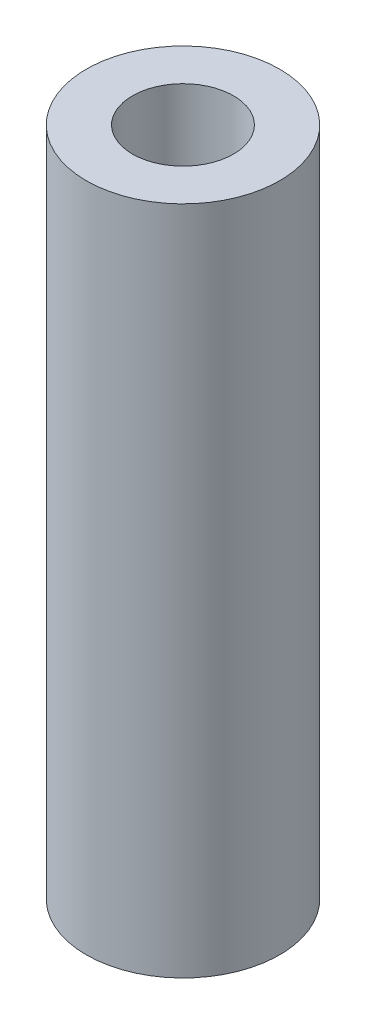
ISO-10303-21;
HEADER;
FILE_DESCRIPTION(('STEP AP214'),'2;1');
FILE_NAME('part.step','',(''),(''),'','','');
FILE_SCHEMA(('AUTOMOTIVE_DESIGN { 1 0 10303 214 1 1 1 1 }'));
ENDSEC;
DATA;
#1=APPLICATION_CONTEXT('core data for automotive mechanical design processes');
#2=APPLICATION_PROTOCOL_DEFINITION('international standard','automotive_design',2000,#1);
#3=PRODUCT_CONTEXT('',#1,'mechanical');
#4=PRODUCT('Part','Part','',(#3));
#5=PRODUCT_RELATED_PRODUCT_CATEGORY('part','',(#4));
#6=PRODUCT_DEFINITION_FORMATION('','',#4);
#7=PRODUCT_DEFINITION_CONTEXT('part definition',#1,'design');
#8=PRODUCT_DEFINITION('design','',#6,#7);
#9=PRODUCT_DEFINITION_SHAPE('','',#8);
#10=(LENGTH_UNIT() NAMED_UNIT(*) SI_UNIT(.MILLI.,.METRE.));
#11=(NAMED_UNIT(*) PLANE_ANGLE_UNIT() SI_UNIT($,.RADIAN.));
#12=(NAMED_UNIT(*) SI_UNIT($,.STERADIAN.) SOLID_ANGLE_UNIT());
#13=UNCERTAINTY_MEASURE_WITH_UNIT(LENGTH_MEASURE(1.E-05),#10,'distance_accuracy_value','');
#14=(GEOMETRIC_REPRESENTATION_CONTEXT(3) GLOBAL_UNCERTAINTY_ASSIGNED_CONTEXT((#13)) GLOBAL_UNIT_ASSIGNED_CONTEXT((#10,
#11,#12)) REPRESENTATION_CONTEXT('',''));
#15=CARTESIAN_POINT('',(0.,0.,0.));
#16=DIRECTION('',(0.,0.,1.));
#17=DIRECTION('',(1.,0.,0.));
#18=AXIS2_PLACEMENT_3D('',#15,#16,#17);
#19=CARTESIAN_POINT('',(0.,33.02,0.));
#20=DIRECTION('',(0.,1.,0.));
#21=DIRECTION('',(0.,0.,1.));
#22=AXIS2_PLACEMENT_3D('',#19,#20,#21);
#23=PLANE('',#22);
#24=CARTESIAN_POINT('',(0.,33.02,0.));
#25=DIRECTION('',(0.,1.,0.));
#26=DIRECTION('',(0.,0.,1.));
#27=AXIS2_PLACEMENT_3D('',#24,#25,#26);
#28=CIRCLE('',#27,4.7625);
#29=CARTESIAN_POINT('',(0.,33.02,4.7625));
#30=VERTEX_POINT('',#29);
#31=EDGE_CURVE('E10',#30,#30,#28,.T.);
#32=ORIENTED_EDGE('',*,*,#31,.T.);
#33=EDGE_LOOP('',(#32));
#34=FACE_BOUND('',#33,.T.);
#35=CARTESIAN_POINT('',(0.,33.02,0.));
#36=DIRECTION('',(0.,1.,0.));
#37=DIRECTION('',(0.,0.,1.));
#38=AXIS2_PLACEMENT_3D('',#35,#36,#37);
#39=CIRCLE('',#38,2.4892);
#40=CARTESIAN_POINT('',(0.,33.02,2.4892));
#41=VERTEX_POINT('',#40);
#42=EDGE_CURVE('E58',#41,#41,#39,.T.);
#43=ORIENTED_EDGE('',*,*,#42,.F.);
#44=EDGE_LOOP('',(#43));
#45=FACE_BOUND('',#44,.T.);
#46=ADVANCED_FACE('F45',(#34,#45),#23,.T.);
#47=CARTESIAN_POINT('',(0.,0.,0.));
#48=DIRECTION('',(0.,1.,0.));
#49=DIRECTION('',(0.,0.,1.));
#50=AXIS2_PLACEMENT_3D('',#47,#48,#49);
#51=PLANE('',#50);
#52=CARTESIAN_POINT('',(0.,0.,0.));
#53=DIRECTION('',(0.,1.,0.));
#54=DIRECTION('',(0.,0.,1.));
#55=AXIS2_PLACEMENT_3D('',#52,#53,#54);
#56=CIRCLE('',#55,4.7625);
#57=CARTESIAN_POINT('',(0.,0.,4.7625));
#58=VERTEX_POINT('',#57);
#59=EDGE_CURVE('E49',#58,#58,#56,.T.);
#60=ORIENTED_EDGE('',*,*,#59,.F.);
#61=EDGE_LOOP('',(#60));
#62=FACE_BOUND('',#61,.T.);
#63=CARTESIAN_POINT('',(0.,0.,0.));
#64=DIRECTION('',(0.,1.,0.));
#65=DIRECTION('',(0.,0.,1.));
#66=AXIS2_PLACEMENT_3D('',#63,#64,#65);
#67=CIRCLE('',#66,2.4892);
#68=CARTESIAN_POINT('',(0.,0.,2.4892));
#69=VERTEX_POINT('',#68);
#70=EDGE_CURVE('E60',#69,#69,#67,.T.);
#71=ORIENTED_EDGE('',*,*,#70,.T.);
#72=EDGE_LOOP('',(#71));
#73=FACE_BOUND('',#72,.T.);
#74=ADVANCED_FACE('F72',(#62,#73),#51,.F.);
#75=CARTESIAN_POINT('',(0.,33.02,0.));
#76=DIRECTION('',(0.,-1.,0.));
#77=DIRECTION('',(0.,0.,-1.));
#78=AXIS2_PLACEMENT_3D('',#75,#76,#77);
#79=CYLINDRICAL_SURFACE('',#78,4.7625);
#80=ORIENTED_EDGE('',*,*,#31,.F.);
#81=EDGE_LOOP('',(#80));
#82=FACE_BOUND('',#81,.T.);
#83=ORIENTED_EDGE('',*,*,#59,.T.);
#84=EDGE_LOOP('',(#83));
#85=FACE_BOUND('',#84,.T.);
#86=ADVANCED_FACE('F47',(#82,#85),#79,.T.);
#87=CARTESIAN_POINT('',(0.,33.02,0.));
#88=DIRECTION('',(0.,-1.,0.));
#89=DIRECTION('',(0.,0.,-1.));
#90=AXIS2_PLACEMENT_3D('',#87,#88,#89);
#91=CYLINDRICAL_SURFACE('',#90,2.4892);
#92=ORIENTED_EDGE('',*,*,#42,.T.);
#93=EDGE_LOOP('',(#92));
#94=FACE_BOUND('',#93,.T.);
#95=ORIENTED_EDGE('',*,*,#70,.F.);
#96=EDGE_LOOP('',(#95));
#97=FACE_BOUND('',#96,.T.);
#98=ADVANCED_FACE('F68',(#94,#97),#91,.F.);
#99=CLOSED_SHELL('',(#46,#74,#86,#98));
#100=MANIFOLD_SOLID_BREP('B2',#99);
#101=ADVANCED_BREP_SHAPE_REPRESENTATION('',(#18,#100),#14);
#102=SHAPE_DEFINITION_REPRESENTATION(#9,#101);
ENDSEC;
END-ISO-10303-21;
